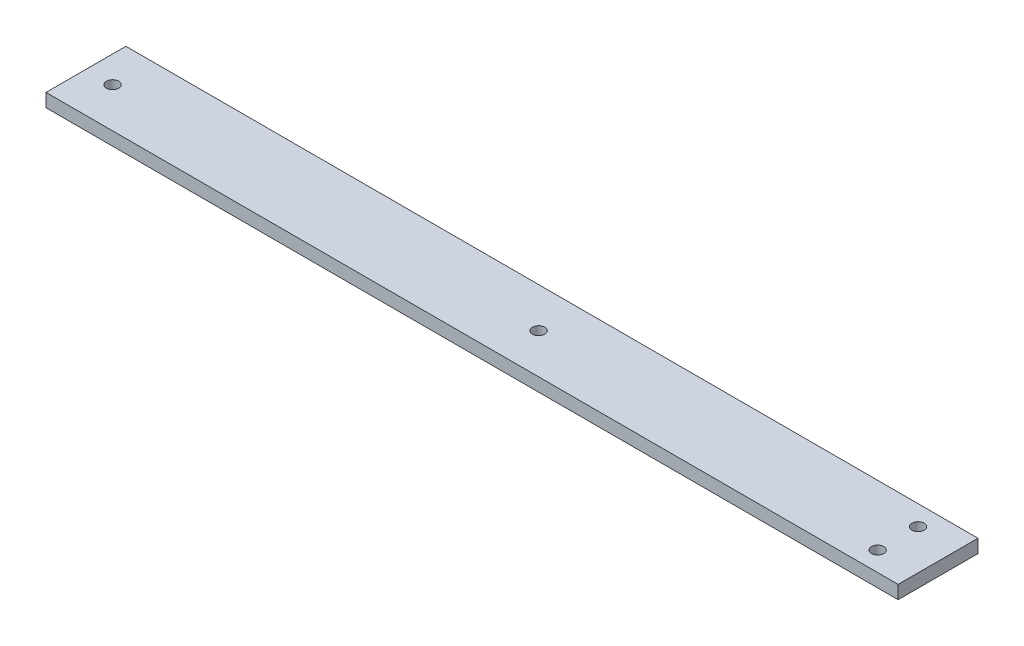
ISO-10303-21;
HEADER;
FILE_DESCRIPTION(('STEP AP214'),'2;1');
FILE_NAME('part.step','',(''),(''),'','','');
FILE_SCHEMA(('AUTOMOTIVE_DESIGN { 1 0 10303 214 1 1 1 1 }'));
ENDSEC;
DATA;
#1=APPLICATION_CONTEXT('core data for automotive mechanical design processes');
#2=APPLICATION_PROTOCOL_DEFINITION('international standard','automotive_design',2000,#1);
#3=PRODUCT_CONTEXT('',#1,'mechanical');
#4=PRODUCT('Part','Part','',(#3));
#5=PRODUCT_RELATED_PRODUCT_CATEGORY('part','',(#4));
#6=PRODUCT_DEFINITION_FORMATION('','',#4);
#7=PRODUCT_DEFINITION_CONTEXT('part definition',#1,'design');
#8=PRODUCT_DEFINITION('design','',#6,#7);
#9=PRODUCT_DEFINITION_SHAPE('','',#8);
#10=(LENGTH_UNIT() NAMED_UNIT(*) SI_UNIT(.MILLI.,.METRE.));
#11=(NAMED_UNIT(*) PLANE_ANGLE_UNIT() SI_UNIT($,.RADIAN.));
#12=(NAMED_UNIT(*) SI_UNIT($,.STERADIAN.) SOLID_ANGLE_UNIT());
#13=UNCERTAINTY_MEASURE_WITH_UNIT(LENGTH_MEASURE(1.E-05),#10,'distance_accuracy_value','');
#14=(GEOMETRIC_REPRESENTATION_CONTEXT(3) GLOBAL_UNCERTAINTY_ASSIGNED_CONTEXT((#13)) GLOBAL_UNIT_ASSIGNED_CONTEXT((#10,
#11,#12)) REPRESENTATION_CONTEXT('',''));
#15=CARTESIAN_POINT('',(0.,0.,0.));
#16=DIRECTION('',(0.,0.,1.));
#17=DIRECTION('',(1.,0.,0.));
#18=AXIS2_PLACEMENT_3D('',#15,#16,#17);
#19=CARTESIAN_POINT('',(0.,3.175,0.));
#20=DIRECTION('',(0.,-1.,0.));
#21=DIRECTION('',(0.,0.,-1.));
#22=AXIS2_PLACEMENT_3D('',#19,#20,#21);
#23=PLANE('',#22);
#24=CARTESIAN_POINT('',(193.675,3.175,-14.2875));
#25=DIRECTION('',(0.,1.,0.));
#26=DIRECTION('',(0.,0.,1.));
#27=AXIS2_PLACEMENT_3D('',#24,#25,#26);
#28=CIRCLE('',#27,1.4605);
#29=CARTESIAN_POINT('',(193.675,3.175,-12.827));
#30=VERTEX_POINT('',#29);
#31=EDGE_CURVE('E115',#30,#30,#28,.T.);
#32=ORIENTED_EDGE('',*,*,#31,.F.);
#33=EDGE_LOOP('',(#32));
#34=FACE_BOUND('',#33,.T.);
#35=CARTESIAN_POINT('',(193.675,3.175,-4.6355));
#36=DIRECTION('',(0.,1.,0.));
#37=DIRECTION('',(0.,0.,1.));
#38=AXIS2_PLACEMENT_3D('',#35,#36,#37);
#39=CIRCLE('',#38,1.46050000000003);
#40=CARTESIAN_POINT('',(193.675,3.175,-3.17499999999997));
#41=VERTEX_POINT('',#40);
#42=EDGE_CURVE('E121',#41,#41,#39,.T.);
#43=ORIENTED_EDGE('',*,*,#42,.F.);
#44=EDGE_LOOP('',(#43));
#45=FACE_BOUND('',#44,.T.);
#46=DIRECTION('',(0.,0.,1.));
#47=VECTOR('',#46,1.);
#48=CARTESIAN_POINT('',(0.,3.175,0.));
#49=LINE('',#48,#47);
#50=CARTESIAN_POINT('',(0.,3.175,-19.05));
#51=VERTEX_POINT('',#50);
#52=CARTESIAN_POINT('',(0.,3.175,0.));
#53=VERTEX_POINT('',#52);
#54=EDGE_CURVE('E92',#51,#53,#49,.T.);
#55=ORIENTED_EDGE('',*,*,#54,.T.);
#56=DIRECTION('',(1.,0.,0.));
#57=VECTOR('',#56,1.);
#58=CARTESIAN_POINT('',(0.,3.175,0.));
#59=LINE('',#58,#57);
#60=CARTESIAN_POINT('',(203.2,3.175,0.));
#61=VERTEX_POINT('',#60);
#62=EDGE_CURVE('E87',#53,#61,#59,.T.);
#63=ORIENTED_EDGE('',*,*,#62,.T.);
#64=DIRECTION('',(0.,0.,-1.));
#65=VECTOR('',#64,1.);
#66=CARTESIAN_POINT('',(203.2,3.175,0.));
#67=LINE('',#66,#65);
#68=CARTESIAN_POINT('',(203.2,3.175,-19.05));
#69=VERTEX_POINT('',#68);
#70=EDGE_CURVE('E90',#61,#69,#67,.T.);
#71=ORIENTED_EDGE('',*,*,#70,.T.);
#72=DIRECTION('',(-1.,0.,0.));
#73=VECTOR('',#72,1.);
#74=CARTESIAN_POINT('',(0.,3.175,-19.05));
#75=LINE('',#74,#73);
#76=EDGE_CURVE('E57',#69,#51,#75,.T.);
#77=ORIENTED_EDGE('',*,*,#76,.T.);
#78=EDGE_LOOP('',(#55,#63,#71,#77));
#79=FACE_BOUND('',#78,.T.);
#80=CARTESIAN_POINT('',(6.35,3.175,-9.525));
#81=DIRECTION('',(0.,1.,0.));
#82=DIRECTION('',(0.,0.,1.));
#83=AXIS2_PLACEMENT_3D('',#80,#81,#82);
#84=CIRCLE('',#83,1.4605);
#85=CARTESIAN_POINT('',(6.35,3.175,-8.0645));
#86=VERTEX_POINT('',#85);
#87=EDGE_CURVE('E108',#86,#86,#84,.T.);
#88=ORIENTED_EDGE('',*,*,#87,.F.);
#89=EDGE_LOOP('',(#88));
#90=FACE_BOUND('',#89,.T.);
#91=CARTESIAN_POINT('',(107.95,3.175,-9.525));
#92=DIRECTION('',(0.,1.,0.));
#93=DIRECTION('',(0.,0.,1.));
#94=AXIS2_PLACEMENT_3D('',#91,#92,#93);
#95=CIRCLE('',#94,1.4605);
#96=CARTESIAN_POINT('',(107.95,3.175,-8.0645));
#97=VERTEX_POINT('',#96);
#98=EDGE_CURVE('E128',#97,#97,#95,.T.);
#99=ORIENTED_EDGE('',*,*,#98,.F.);
#100=EDGE_LOOP('',(#99));
#101=FACE_BOUND('',#100,.T.);
#102=ADVANCED_FACE('F38',(#34,#45,#79,#90,#101),#23,.F.);
#103=CARTESIAN_POINT('',(0.,0.,0.));
#104=DIRECTION('',(0.,-1.,0.));
#105=DIRECTION('',(0.,0.,-1.));
#106=AXIS2_PLACEMENT_3D('',#103,#104,#105);
#107=PLANE('',#106);
#108=CARTESIAN_POINT('',(193.675,0.,-14.2875));
#109=DIRECTION('',(0.,-1.,0.));
#110=DIRECTION('',(0.,0.,-1.));
#111=AXIS2_PLACEMENT_3D('',#108,#109,#110);
#112=CIRCLE('',#111,1.4605);
#113=CARTESIAN_POINT('',(193.675,0.,-15.748));
#114=VERTEX_POINT('',#113);
#115=EDGE_CURVE('E42',#114,#114,#112,.T.);
#116=ORIENTED_EDGE('',*,*,#115,.F.);
#117=EDGE_LOOP('',(#116));
#118=FACE_BOUND('',#117,.T.);
#119=CARTESIAN_POINT('',(193.675,0.,-4.6355));
#120=DIRECTION('',(0.,-1.,0.));
#121=DIRECTION('',(0.,0.,-1.));
#122=AXIS2_PLACEMENT_3D('',#119,#120,#121);
#123=CIRCLE('',#122,1.46050000000003);
#124=CARTESIAN_POINT('',(193.675,0.,-6.09600000000002));
#125=VERTEX_POINT('',#124);
#126=EDGE_CURVE('E113',#125,#125,#123,.T.);
#127=ORIENTED_EDGE('',*,*,#126,.F.);
#128=EDGE_LOOP('',(#127));
#129=FACE_BOUND('',#128,.T.);
#130=CARTESIAN_POINT('',(6.35,0.,-9.525));
#131=DIRECTION('',(0.,1.,0.));
#132=DIRECTION('',(0.,0.,1.));
#133=AXIS2_PLACEMENT_3D('',#130,#131,#132);
#134=CIRCLE('',#133,1.4605);
#135=CARTESIAN_POINT('',(6.35,0.,-8.0645));
#136=VERTEX_POINT('',#135);
#137=EDGE_CURVE('E131',#136,#136,#134,.T.);
#138=ORIENTED_EDGE('',*,*,#137,.T.);
#139=EDGE_LOOP('',(#138));
#140=FACE_BOUND('',#139,.T.);
#141=DIRECTION('',(0.,0.,1.));
#142=VECTOR('',#141,1.);
#143=CARTESIAN_POINT('',(0.,0.,0.));
#144=LINE('',#143,#142);
#145=CARTESIAN_POINT('',(0.,0.,-19.05));
#146=VERTEX_POINT('',#145);
#147=CARTESIAN_POINT('',(0.,0.,0.));
#148=VERTEX_POINT('',#147);
#149=EDGE_CURVE('E105',#146,#148,#144,.T.);
#150=ORIENTED_EDGE('',*,*,#149,.F.);
#151=DIRECTION('',(-1.,0.,0.));
#152=VECTOR('',#151,1.);
#153=CARTESIAN_POINT('',(0.,0.,-19.05));
#154=LINE('',#153,#152);
#155=CARTESIAN_POINT('',(203.2,0.,-19.05));
#156=VERTEX_POINT('',#155);
#157=EDGE_CURVE('E80',#156,#146,#154,.T.);
#158=ORIENTED_EDGE('',*,*,#157,.F.);
#159=DIRECTION('',(0.,0.,-1.));
#160=VECTOR('',#159,1.);
#161=CARTESIAN_POINT('',(203.2,0.,0.));
#162=LINE('',#161,#160);
#163=CARTESIAN_POINT('',(203.2,0.,0.));
#164=VERTEX_POINT('',#163);
#165=EDGE_CURVE('E74',#164,#156,#162,.T.);
#166=ORIENTED_EDGE('',*,*,#165,.F.);
#167=DIRECTION('',(1.,0.,0.));
#168=VECTOR('',#167,1.);
#169=CARTESIAN_POINT('',(0.,0.,0.));
#170=LINE('',#169,#168);
#171=EDGE_CURVE('E96',#148,#164,#170,.T.);
#172=ORIENTED_EDGE('',*,*,#171,.F.);
#173=EDGE_LOOP('',(#150,#158,#166,#172));
#174=FACE_BOUND('',#173,.T.);
#175=CARTESIAN_POINT('',(107.95,0.,-9.525));
#176=DIRECTION('',(0.,1.,0.));
#177=DIRECTION('',(0.,0.,1.));
#178=AXIS2_PLACEMENT_3D('',#175,#176,#177);
#179=CIRCLE('',#178,1.4605);
#180=CARTESIAN_POINT('',(107.95,0.,-8.0645));
#181=VERTEX_POINT('',#180);
#182=EDGE_CURVE('E119',#181,#181,#179,.T.);
#183=ORIENTED_EDGE('',*,*,#182,.T.);
#184=EDGE_LOOP('',(#183));
#185=FACE_BOUND('',#184,.T.);
#186=ADVANCED_FACE('F139',(#118,#129,#140,#174,#185),#107,.T.);
#187=CARTESIAN_POINT('',(0.,3.175,0.));
#188=DIRECTION('',(1.,0.,0.));
#189=DIRECTION('',(0.,0.,-1.));
#190=AXIS2_PLACEMENT_3D('',#187,#188,#189);
#191=PLANE('',#190);
#192=ORIENTED_EDGE('',*,*,#149,.T.);
#193=DIRECTION('',(0.,-1.,0.));
#194=VECTOR('',#193,1.);
#195=CARTESIAN_POINT('',(0.,3.175,0.));
#196=LINE('',#195,#194);
#197=EDGE_CURVE('E11',#53,#148,#196,.T.);
#198=ORIENTED_EDGE('',*,*,#197,.F.);
#199=ORIENTED_EDGE('',*,*,#54,.F.);
#200=DIRECTION('',(0.,-1.,0.));
#201=VECTOR('',#200,1.);
#202=CARTESIAN_POINT('',(0.,3.175,-19.05));
#203=LINE('',#202,#201);
#204=EDGE_CURVE('E101',#51,#146,#203,.T.);
#205=ORIENTED_EDGE('',*,*,#204,.T.);
#206=EDGE_LOOP('',(#192,#198,#199,#205));
#207=FACE_BOUND('',#206,.T.);
#208=ADVANCED_FACE('F40',(#207),#191,.F.);
#209=CARTESIAN_POINT('',(0.,3.175,0.));
#210=DIRECTION('',(0.,0.,-1.));
#211=DIRECTION('',(-1.,0.,0.));
#212=AXIS2_PLACEMENT_3D('',#209,#210,#211);
#213=PLANE('',#212);
#214=ORIENTED_EDGE('',*,*,#171,.T.);
#215=DIRECTION('',(0.,-1.,0.));
#216=VECTOR('',#215,1.);
#217=CARTESIAN_POINT('',(203.2,3.175,0.));
#218=LINE('',#217,#216);
#219=EDGE_CURVE('E48',#61,#164,#218,.T.);
#220=ORIENTED_EDGE('',*,*,#219,.F.);
#221=ORIENTED_EDGE('',*,*,#62,.F.);
#222=ORIENTED_EDGE('',*,*,#197,.T.);
#223=EDGE_LOOP('',(#214,#220,#221,#222));
#224=FACE_BOUND('',#223,.T.);
#225=ADVANCED_FACE('F95',(#224),#213,.F.);
#226=CARTESIAN_POINT('',(203.2,3.175,0.));
#227=DIRECTION('',(-1.,0.,0.));
#228=DIRECTION('',(0.,0.,1.));
#229=AXIS2_PLACEMENT_3D('',#226,#227,#228);
#230=PLANE('',#229);
#231=ORIENTED_EDGE('',*,*,#165,.T.);
#232=DIRECTION('',(0.,-1.,0.));
#233=VECTOR('',#232,1.);
#234=CARTESIAN_POINT('',(203.2,3.175,-19.05));
#235=LINE('',#234,#233);
#236=EDGE_CURVE('E97',#69,#156,#235,.T.);
#237=ORIENTED_EDGE('',*,*,#236,.F.);
#238=ORIENTED_EDGE('',*,*,#70,.F.);
#239=ORIENTED_EDGE('',*,*,#219,.T.);
#240=EDGE_LOOP('',(#231,#237,#238,#239));
#241=FACE_BOUND('',#240,.T.);
#242=ADVANCED_FACE('F99',(#241),#230,.F.);
#243=CARTESIAN_POINT('',(0.,3.175,-19.05));
#244=DIRECTION('',(0.,0.,1.));
#245=DIRECTION('',(1.,0.,0.));
#246=AXIS2_PLACEMENT_3D('',#243,#244,#245);
#247=PLANE('',#246);
#248=ORIENTED_EDGE('',*,*,#157,.T.);
#249=ORIENTED_EDGE('',*,*,#204,.F.);
#250=ORIENTED_EDGE('',*,*,#76,.F.);
#251=ORIENTED_EDGE('',*,*,#236,.T.);
#252=EDGE_LOOP('',(#248,#249,#250,#251));
#253=FACE_BOUND('',#252,.T.);
#254=ADVANCED_FACE('F145',(#253),#247,.F.);
#255=CARTESIAN_POINT('',(6.35,3.175,-9.525));
#256=DIRECTION('',(0.,-1.,0.));
#257=DIRECTION('',(0.,0.,-1.));
#258=AXIS2_PLACEMENT_3D('',#255,#256,#257);
#259=CYLINDRICAL_SURFACE('',#258,1.4605);
#260=ORIENTED_EDGE('',*,*,#87,.T.);
#261=EDGE_LOOP('',(#260));
#262=FACE_BOUND('',#261,.T.);
#263=ORIENTED_EDGE('',*,*,#137,.F.);
#264=EDGE_LOOP('',(#263));
#265=FACE_BOUND('',#264,.T.);
#266=ADVANCED_FACE('F142',(#262,#265),#259,.F.);
#267=CARTESIAN_POINT('',(107.95,3.175,-9.525));
#268=DIRECTION('',(0.,-1.,0.));
#269=DIRECTION('',(0.,0.,-1.));
#270=AXIS2_PLACEMENT_3D('',#267,#268,#269);
#271=CYLINDRICAL_SURFACE('',#270,1.4605);
#272=ORIENTED_EDGE('',*,*,#98,.T.);
#273=EDGE_LOOP('',(#272));
#274=FACE_BOUND('',#273,.T.);
#275=ORIENTED_EDGE('',*,*,#182,.F.);
#276=EDGE_LOOP('',(#275));
#277=FACE_BOUND('',#276,.T.);
#278=ADVANCED_FACE('F144',(#274,#277),#271,.F.);
#279=CARTESIAN_POINT('',(193.675,-6.35,-4.6355));
#280=DIRECTION('',(0.,1.,0.));
#281=DIRECTION('',(0.,0.,1.));
#282=AXIS2_PLACEMENT_3D('',#279,#280,#281);
#283=CYLINDRICAL_SURFACE('',#282,1.46050000000003);
#284=ORIENTED_EDGE('',*,*,#126,.T.);
#285=EDGE_LOOP('',(#284));
#286=FACE_BOUND('',#285,.T.);
#287=ORIENTED_EDGE('',*,*,#42,.T.);
#288=EDGE_LOOP('',(#287));
#289=FACE_BOUND('',#288,.T.);
#290=ADVANCED_FACE('F152',(#286,#289),#283,.F.);
#291=CARTESIAN_POINT('',(193.675,-6.35,-14.2875));
#292=DIRECTION('',(0.,1.,0.));
#293=DIRECTION('',(0.,0.,1.));
#294=AXIS2_PLACEMENT_3D('',#291,#292,#293);
#295=CYLINDRICAL_SURFACE('',#294,1.4605);
#296=ORIENTED_EDGE('',*,*,#115,.T.);
#297=EDGE_LOOP('',(#296));
#298=FACE_BOUND('',#297,.T.);
#299=ORIENTED_EDGE('',*,*,#31,.T.);
#300=EDGE_LOOP('',(#299));
#301=FACE_BOUND('',#300,.T.);
#302=ADVANCED_FACE('F218',(#298,#301),#295,.F.);
#303=CLOSED_SHELL('',(#102,#186,#208,#225,#242,#254,#266,#278,#290,#302));
#304=MANIFOLD_SOLID_BREP('B2',#303);
#305=ADVANCED_BREP_SHAPE_REPRESENTATION('',(#18,#304),#14);
#306=SHAPE_DEFINITION_REPRESENTATION(#9,#305);
ENDSEC;
END-ISO-10303-21;
